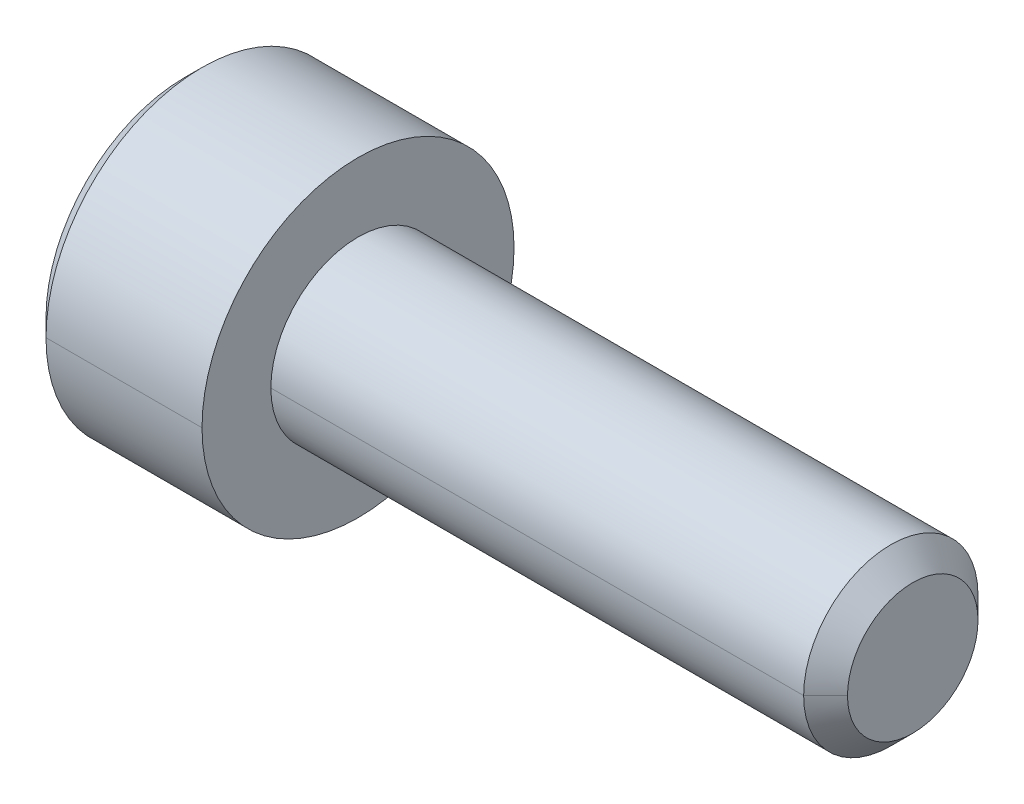
ISO-10303-21;
HEADER;
FILE_DESCRIPTION(('STEP AP214'),'2;1');
FILE_NAME('part.step','',(''),(''),'','','');
FILE_SCHEMA(('AUTOMOTIVE_DESIGN { 1 0 10303 214 1 1 1 1 }'));
ENDSEC;
DATA;
#1=APPLICATION_CONTEXT('core data for automotive mechanical design processes');
#2=APPLICATION_PROTOCOL_DEFINITION('international standard','automotive_design',2000,#1);
#3=PRODUCT_CONTEXT('',#1,'mechanical');
#4=PRODUCT('Part','Part','',(#3));
#5=PRODUCT_RELATED_PRODUCT_CATEGORY('part','',(#4));
#6=PRODUCT_DEFINITION_FORMATION('','',#4);
#7=PRODUCT_DEFINITION_CONTEXT('part definition',#1,'design');
#8=PRODUCT_DEFINITION('design','',#6,#7);
#9=PRODUCT_DEFINITION_SHAPE('','',#8);
#10=(LENGTH_UNIT() NAMED_UNIT(*) SI_UNIT(.MILLI.,.METRE.));
#11=(NAMED_UNIT(*) PLANE_ANGLE_UNIT() SI_UNIT($,.RADIAN.));
#12=(NAMED_UNIT(*) SI_UNIT($,.STERADIAN.) SOLID_ANGLE_UNIT());
#13=UNCERTAINTY_MEASURE_WITH_UNIT(LENGTH_MEASURE(1.E-05),#10,'distance_accuracy_value','');
#14=(GEOMETRIC_REPRESENTATION_CONTEXT(3) GLOBAL_UNCERTAINTY_ASSIGNED_CONTEXT((#13)) GLOBAL_UNIT_ASSIGNED_CONTEXT((#10,
#11,#12)) REPRESENTATION_CONTEXT('',''));
#15=CARTESIAN_POINT('',(0.,0.,0.));
#16=DIRECTION('',(0.,0.,1.));
#17=DIRECTION('',(1.,0.,0.));
#18=AXIS2_PLACEMENT_3D('',#15,#16,#17);
#19=CARTESIAN_POINT('',(-2.50000008,1.016,0.));
#20=DIRECTION('',(1.,0.,0.));
#21=DIRECTION('',(0.,0.,-1.));
#22=AXIS2_PLACEMENT_3D('',#19,#20,#21);
#23=PLANE('',#22);
#24=CARTESIAN_POINT('',(-2.50000008,0.,0.));
#25=DIRECTION('',(1.,0.,0.));
#26=DIRECTION('',(0.,0.,-1.));
#27=AXIS2_PLACEMENT_3D('',#24,#25,#26);
#28=CIRCLE('',#27,2.00006407);
#29=CARTESIAN_POINT('',(-2.50000008,0.,2.00006407));
#30=VERTEX_POINT('',#29);
#31=CARTESIAN_POINT('',(-2.50000008,0.,-2.00006407));
#32=VERTEX_POINT('',#31);
#33=EDGE_CURVE('E11',#30,#32,#28,.T.);
#34=ORIENTED_EDGE('',*,*,#33,.F.);
#35=CARTESIAN_POINT('',(-2.50000008,0.,0.));
#36=DIRECTION('',(1.,0.,0.));
#37=DIRECTION('',(0.,0.,-1.));
#38=AXIS2_PLACEMENT_3D('',#35,#36,#37);
#39=CIRCLE('',#38,2.00006407);
#40=EDGE_CURVE('E25',#32,#30,#39,.T.);
#41=ORIENTED_EDGE('',*,*,#40,.F.);
#42=EDGE_LOOP('',(#34,#41));
#43=FACE_BOUND('',#42,.T.);
#44=DIRECTION('',(0.,0.866025403784439,-0.5));
#45=VECTOR('',#44,1.);
#46=CARTESIAN_POINT('',(-2.50000008,0.,1.1806547423804));
#47=LINE('',#46,#45);
#48=CARTESIAN_POINT('',(-2.50000008,0.,1.1806547423804));
#49=VERTEX_POINT('',#48);
#50=CARTESIAN_POINT('',(-2.50000008,1.022477,0.5903273711902));
#51=VERTEX_POINT('',#50);
#52=EDGE_CURVE('E300',#49,#51,#47,.T.);
#53=ORIENTED_EDGE('',*,*,#52,.F.);
#54=DIRECTION('',(0.,0.866025403784439,0.5));
#55=VECTOR('',#54,1.);
#56=CARTESIAN_POINT('',(-2.50000008,-1.022477,0.5903273711902));
#57=LINE('',#56,#55);
#58=CARTESIAN_POINT('',(-2.50000008,-1.022477,0.5903273711902));
#59=VERTEX_POINT('',#58);
#60=EDGE_CURVE('E295',#59,#49,#57,.T.);
#61=ORIENTED_EDGE('',*,*,#60,.F.);
#62=DIRECTION('',(0.,0.,1.));
#63=VECTOR('',#62,1.);
#64=CARTESIAN_POINT('',(-2.50000008,-1.022477,-0.5903273711902));
#65=LINE('',#64,#63);
#66=CARTESIAN_POINT('',(-2.50000008,-1.022477,-0.5903273711902));
#67=VERTEX_POINT('',#66);
#68=EDGE_CURVE('E290',#67,#59,#65,.T.);
#69=ORIENTED_EDGE('',*,*,#68,.F.);
#70=DIRECTION('',(0.,-0.866025403784439,0.5));
#71=VECTOR('',#70,1.);
#72=CARTESIAN_POINT('',(-2.50000008,0.,-1.1806547423804));
#73=LINE('',#72,#71);
#74=CARTESIAN_POINT('',(-2.50000008,0.,-1.1806547423804));
#75=VERTEX_POINT('',#74);
#76=EDGE_CURVE('E285',#75,#67,#73,.T.);
#77=ORIENTED_EDGE('',*,*,#76,.F.);
#78=DIRECTION('',(0.,-0.866025403784439,-0.5));
#79=VECTOR('',#78,1.);
#80=CARTESIAN_POINT('',(-2.50000008,1.022477,-0.5903273711902));
#81=LINE('',#80,#79);
#82=CARTESIAN_POINT('',(-2.50000008,1.022477,-0.5903273711902));
#83=VERTEX_POINT('',#82);
#84=EDGE_CURVE('E280',#83,#75,#81,.T.);
#85=ORIENTED_EDGE('',*,*,#84,.F.);
#86=DIRECTION('',(0.,0.,1.));
#87=VECTOR('',#86,1.);
#88=CARTESIAN_POINT('',(-2.50000008,1.022477,0.));
#89=LINE('',#88,#87);
#90=EDGE_CURVE('E276',#83,#51,#89,.T.);
#91=ORIENTED_EDGE('',*,*,#90,.T.);
#92=EDGE_LOOP('',(#53,#61,#69,#77,#85,#91));
#93=FACE_BOUND('',#92,.T.);
#94=ADVANCED_FACE('F17',(#43,#93),#23,.F.);
#95=CARTESIAN_POINT('',(-1.40780008,1.022477,0.5903273711902));
#96=DIRECTION('',(0.,1.,0.));
#97=DIRECTION('',(0.,0.,1.));
#98=AXIS2_PLACEMENT_3D('',#95,#96,#97);
#99=PLANE('',#98);
#100=DIRECTION('',(-1.,0.,0.));
#101=VECTOR('',#100,1.);
#102=CARTESIAN_POINT('',(-1.40780008,1.022477,0.5903273711902));
#103=LINE('',#102,#101);
#104=CARTESIAN_POINT('',(-1.40780008,1.022477,0.5903273711902));
#105=VERTEX_POINT('',#104);
#106=EDGE_CURVE('E271',#105,#51,#103,.T.);
#107=ORIENTED_EDGE('',*,*,#106,.T.);
#108=ORIENTED_EDGE('',*,*,#90,.F.);
#109=DIRECTION('',(-1.,0.,0.));
#110=VECTOR('',#109,1.);
#111=CARTESIAN_POINT('',(-1.40780008,1.022477,-0.5903273711902));
#112=LINE('',#111,#110);
#113=CARTESIAN_POINT('',(-1.40780008,1.022477,-0.5903273711902));
#114=VERTEX_POINT('',#113);
#115=EDGE_CURVE('E266',#114,#83,#112,.T.);
#116=ORIENTED_EDGE('',*,*,#115,.F.);
#117=DIRECTION('',(0.,0.,-1.));
#118=VECTOR('',#117,1.);
#119=CARTESIAN_POINT('',(-1.40780008,1.022477,0.5903273711902));
#120=LINE('',#119,#118);
#121=EDGE_CURVE('E261',#105,#114,#120,.T.);
#122=ORIENTED_EDGE('',*,*,#121,.F.);
#123=EDGE_LOOP('',(#107,#108,#116,#122));
#124=FACE_BOUND('',#123,.T.);
#125=ADVANCED_FACE('F335',(#124),#99,.F.);
#126=CARTESIAN_POINT('',(-1.40780008,0.,0.));
#127=DIRECTION('',(-1.,0.,0.));
#128=DIRECTION('',(0.,0.,1.));
#129=AXIS2_PLACEMENT_3D('',#126,#127,#128);
#130=PLANE('',#129);
#131=DIRECTION('',(0.,0.,1.));
#132=VECTOR('',#131,1.);
#133=CARTESIAN_POINT('',(-1.40780008,-1.022477,-0.5903273711902));
#134=LINE('',#133,#132);
#135=CARTESIAN_POINT('',(-1.40780008,-1.022477,-0.5903273711902));
#136=VERTEX_POINT('',#135);
#137=CARTESIAN_POINT('',(-1.40780008,-1.022477,0.5903273711902));
#138=VERTEX_POINT('',#137);
#139=EDGE_CURVE('E257',#136,#138,#134,.T.);
#140=ORIENTED_EDGE('',*,*,#139,.T.);
#141=DIRECTION('',(0.,0.866025403784439,0.5));
#142=VECTOR('',#141,1.);
#143=CARTESIAN_POINT('',(-1.40780008,-1.022477,0.5903273711902));
#144=LINE('',#143,#142);
#145=CARTESIAN_POINT('',(-1.40780008,0.,1.1806547423804));
#146=VERTEX_POINT('',#145);
#147=EDGE_CURVE('E253',#138,#146,#144,.T.);
#148=ORIENTED_EDGE('',*,*,#147,.T.);
#149=DIRECTION('',(0.,0.866025403784439,-0.5));
#150=VECTOR('',#149,1.);
#151=CARTESIAN_POINT('',(-1.40780008,0.,1.1806547423804));
#152=LINE('',#151,#150);
#153=EDGE_CURVE('E248',#146,#105,#152,.T.);
#154=ORIENTED_EDGE('',*,*,#153,.T.);
#155=ORIENTED_EDGE('',*,*,#121,.T.);
#156=DIRECTION('',(0.,-0.866025403784439,-0.5));
#157=VECTOR('',#156,1.);
#158=CARTESIAN_POINT('',(-1.40780008,1.022477,-0.5903273711902));
#159=LINE('',#158,#157);
#160=CARTESIAN_POINT('',(-1.40780008,0.,-1.1806547423804));
#161=VERTEX_POINT('',#160);
#162=EDGE_CURVE('E244',#114,#161,#159,.T.);
#163=ORIENTED_EDGE('',*,*,#162,.T.);
#164=DIRECTION('',(0.,-0.866025403784439,0.5));
#165=VECTOR('',#164,1.);
#166=CARTESIAN_POINT('',(-1.40780008,0.,-1.1806547423804));
#167=LINE('',#166,#165);
#168=EDGE_CURVE('E240',#161,#136,#167,.T.);
#169=ORIENTED_EDGE('',*,*,#168,.T.);
#170=EDGE_LOOP('',(#140,#148,#154,#155,#163,#169));
#171=FACE_BOUND('',#170,.T.);
#172=CARTESIAN_POINT('',(-1.40780008,0.,0.));
#173=DIRECTION('',(1.,0.,0.));
#174=DIRECTION('',(0.,0.,1.));
#175=AXIS2_PLACEMENT_3D('',#172,#173,#174);
#176=CIRCLE('',#175,1.00003203499993);
#177=CARTESIAN_POINT('',(-1.40780008,0.,1.00003203499993));
#178=VERTEX_POINT('',#177);
#179=CARTESIAN_POINT('',(-1.40780008,0.,-1.00003203499993));
#180=VERTEX_POINT('',#179);
#181=EDGE_CURVE('E236',#178,#180,#176,.T.);
#182=ORIENTED_EDGE('',*,*,#181,.T.);
#183=CARTESIAN_POINT('',(-1.40780008,0.,0.));
#184=DIRECTION('',(1.,0.,0.));
#185=DIRECTION('',(0.,0.,1.));
#186=AXIS2_PLACEMENT_3D('',#183,#184,#185);
#187=CIRCLE('',#186,1.00003203499993);
#188=EDGE_CURVE('E232',#180,#178,#187,.T.);
#189=ORIENTED_EDGE('',*,*,#188,.T.);
#190=EDGE_LOOP('',(#182,#189));
#191=FACE_BOUND('',#190,.T.);
#192=ADVANCED_FACE('F339',(#171,#191),#130,.T.);
#193=CARTESIAN_POINT('',(-0.8304313153945,0.,0.));
#194=DIRECTION('',(-1.,0.,0.));
#195=DIRECTION('',(0.,-1.,0.));
#196=AXIS2_PLACEMENT_3D('',#193,#194,#195);
#197=CONICAL_SURFACE('',#196,0.,1.04719755119657);
#198=DIRECTION('',(-0.500000000000026,0.,0.866025403784424));
#199=VECTOR('',#198,1.);
#200=CARTESIAN_POINT('',(-0.8304313153945,0.,0.));
#201=LINE('',#200,#199);
#202=CARTESIAN_POINT('',(-0.8304313153945,0.,0.));
#203=VERTEX_POINT('',#202);
#204=EDGE_CURVE('E227',#203,#178,#201,.T.);
#205=ORIENTED_EDGE('',*,*,#204,.T.);
#206=ORIENTED_EDGE('',*,*,#188,.F.);
#207=DIRECTION('',(-0.500000000000026,0.,-0.866025403784424));
#208=VECTOR('',#207,1.);
#209=CARTESIAN_POINT('',(-0.8304313153945,0.,0.));
#210=LINE('',#209,#208);
#211=EDGE_CURVE('E222',#203,#180,#210,.T.);
#212=ORIENTED_EDGE('',*,*,#211,.F.);
#213=EDGE_LOOP('',(#205,#206,#212));
#214=FACE_BOUND('',#213,.T.);
#215=ADVANCED_FACE('F366',(#214),#197,.F.);
#216=CARTESIAN_POINT('',(-0.8304313153945,0.,0.));
#217=DIRECTION('',(-1.,0.,0.));
#218=DIRECTION('',(0.,1.,0.));
#219=AXIS2_PLACEMENT_3D('',#216,#217,#218);
#220=CONICAL_SURFACE('',#219,0.,1.04719755119657);
#221=ORIENTED_EDGE('',*,*,#211,.T.);
#222=ORIENTED_EDGE('',*,*,#181,.F.);
#223=ORIENTED_EDGE('',*,*,#204,.F.);
#224=EDGE_LOOP('',(#221,#222,#223));
#225=FACE_BOUND('',#224,.T.);
#226=ADVANCED_FACE('F372',(#225),#220,.F.);
#227=CARTESIAN_POINT('',(-1.40780008,0.,-1.1806547423804));
#228=DIRECTION('',(0.,-0.5,-0.866025403784439));
#229=DIRECTION('',(0.,0.866025403784439,-0.5));
#230=AXIS2_PLACEMENT_3D('',#227,#228,#229);
#231=PLANE('',#230);
#232=ORIENTED_EDGE('',*,*,#76,.T.);
#233=DIRECTION('',(-1.,0.,0.));
#234=VECTOR('',#233,1.);
#235=CARTESIAN_POINT('',(-1.40780008,-1.022477,-0.5903273711902));
#236=LINE('',#235,#234);
#237=EDGE_CURVE('E217',#136,#67,#236,.T.);
#238=ORIENTED_EDGE('',*,*,#237,.F.);
#239=ORIENTED_EDGE('',*,*,#168,.F.);
#240=DIRECTION('',(-1.,0.,0.));
#241=VECTOR('',#240,1.);
#242=CARTESIAN_POINT('',(-1.40780008,0.,-1.1806547423804));
#243=LINE('',#242,#241);
#244=EDGE_CURVE('E212',#161,#75,#243,.T.);
#245=ORIENTED_EDGE('',*,*,#244,.T.);
#246=EDGE_LOOP('',(#232,#238,#239,#245));
#247=FACE_BOUND('',#246,.T.);
#248=ADVANCED_FACE('F359',(#247),#231,.F.);
#249=CARTESIAN_POINT('',(-1.40780008,1.022477,-0.5903273711902));
#250=DIRECTION('',(0.,0.5,-0.866025403784439));
#251=DIRECTION('',(0.,0.866025403784439,0.5));
#252=AXIS2_PLACEMENT_3D('',#249,#250,#251);
#253=PLANE('',#252);
#254=ORIENTED_EDGE('',*,*,#84,.T.);
#255=ORIENTED_EDGE('',*,*,#244,.F.);
#256=ORIENTED_EDGE('',*,*,#162,.F.);
#257=ORIENTED_EDGE('',*,*,#115,.T.);
#258=EDGE_LOOP('',(#254,#255,#256,#257));
#259=FACE_BOUND('',#258,.T.);
#260=ADVANCED_FACE('F362',(#259),#253,.F.);
#261=CARTESIAN_POINT('',(-1.40780008,-1.022477,-0.5903273711902));
#262=DIRECTION('',(0.,-1.,0.));
#263=DIRECTION('',(0.,0.,-1.));
#264=AXIS2_PLACEMENT_3D('',#261,#262,#263);
#265=PLANE('',#264);
#266=ORIENTED_EDGE('',*,*,#68,.T.);
#267=DIRECTION('',(-1.,0.,0.));
#268=VECTOR('',#267,1.);
#269=CARTESIAN_POINT('',(-1.40780008,-1.022477,0.5903273711902));
#270=LINE('',#269,#268);
#271=EDGE_CURVE('E207',#138,#59,#270,.T.);
#272=ORIENTED_EDGE('',*,*,#271,.F.);
#273=ORIENTED_EDGE('',*,*,#139,.F.);
#274=ORIENTED_EDGE('',*,*,#237,.T.);
#275=EDGE_LOOP('',(#266,#272,#273,#274));
#276=FACE_BOUND('',#275,.T.);
#277=ADVANCED_FACE('F354',(#276),#265,.F.);
#278=CARTESIAN_POINT('',(-1.40780008,-1.022477,0.5903273711902));
#279=DIRECTION('',(0.,-0.5,0.866025403784439));
#280=DIRECTION('',(0.,-0.866025403784439,-0.5));
#281=AXIS2_PLACEMENT_3D('',#278,#279,#280);
#282=PLANE('',#281);
#283=ORIENTED_EDGE('',*,*,#60,.T.);
#284=DIRECTION('',(-1.,0.,0.));
#285=VECTOR('',#284,1.);
#286=CARTESIAN_POINT('',(-1.40780008,0.,1.1806547423804));
#287=LINE('',#286,#285);
#288=EDGE_CURVE('E202',#146,#49,#287,.T.);
#289=ORIENTED_EDGE('',*,*,#288,.F.);
#290=ORIENTED_EDGE('',*,*,#147,.F.);
#291=ORIENTED_EDGE('',*,*,#271,.T.);
#292=EDGE_LOOP('',(#283,#289,#290,#291));
#293=FACE_BOUND('',#292,.T.);
#294=ADVANCED_FACE('F350',(#293),#282,.F.);
#295=CARTESIAN_POINT('',(-1.40780008,0.,1.1806547423804));
#296=DIRECTION('',(0.,0.5,0.866025403784439));
#297=DIRECTION('',(0.,-0.866025403784439,0.5));
#298=AXIS2_PLACEMENT_3D('',#295,#296,#297);
#299=PLANE('',#298);
#300=ORIENTED_EDGE('',*,*,#52,.T.);
#301=ORIENTED_EDGE('',*,*,#106,.F.);
#302=ORIENTED_EDGE('',*,*,#153,.F.);
#303=ORIENTED_EDGE('',*,*,#288,.T.);
#304=EDGE_LOOP('',(#300,#301,#302,#303));
#305=FACE_BOUND('',#304,.T.);
#306=ADVANCED_FACE('F347',(#305),#299,.F.);
#307=CARTESIAN_POINT('',(-2.50000008,0.,0.));
#308=DIRECTION('',(1.,0.,0.));
#309=DIRECTION('',(0.,-1.,0.));
#310=AXIS2_PLACEMENT_3D('',#307,#308,#309);
#311=CONICAL_SURFACE('',#310,2.00006407,0.785398163397446);
#312=DIRECTION('',(0.707106781186549,0.,0.707106781186546));
#313=VECTOR('',#312,1.);
#314=CARTESIAN_POINT('',(-2.50000008,0.,2.00006407));
#315=LINE('',#314,#313);
#316=CARTESIAN_POINT('',(-2.25006408,0.,2.25000007));
#317=VERTEX_POINT('',#316);
#318=EDGE_CURVE('E198',#30,#317,#315,.T.);
#319=ORIENTED_EDGE('',*,*,#318,.T.);
#320=CARTESIAN_POINT('',(-2.25006408,0.,0.));
#321=DIRECTION('',(1.,0.,0.));
#322=DIRECTION('',(0.,0.,-1.));
#323=AXIS2_PLACEMENT_3D('',#320,#321,#322);
#324=CIRCLE('',#323,2.25000007);
#325=CARTESIAN_POINT('',(-2.25006408,0.,-2.25000007));
#326=VERTEX_POINT('',#325);
#327=EDGE_CURVE('E193',#326,#317,#324,.T.);
#328=ORIENTED_EDGE('',*,*,#327,.F.);
#329=DIRECTION('',(0.707106781186549,0.,-0.707106781186546));
#330=VECTOR('',#329,1.);
#331=CARTESIAN_POINT('',(-2.50000008,0.,-2.00006407));
#332=LINE('',#331,#330);
#333=EDGE_CURVE('E188',#32,#326,#332,.T.);
#334=ORIENTED_EDGE('',*,*,#333,.F.);
#335=ORIENTED_EDGE('',*,*,#40,.T.);
#336=EDGE_LOOP('',(#319,#328,#334,#335));
#337=FACE_BOUND('',#336,.T.);
#338=ADVANCED_FACE('F310',(#337),#311,.T.);
#339=CARTESIAN_POINT('',(-2.50000008,0.,0.));
#340=DIRECTION('',(1.,0.,0.));
#341=DIRECTION('',(0.,1.,0.));
#342=AXIS2_PLACEMENT_3D('',#339,#340,#341);
#343=CONICAL_SURFACE('',#342,2.00006407,0.785398163397446);
#344=ORIENTED_EDGE('',*,*,#318,.F.);
#345=ORIENTED_EDGE('',*,*,#33,.T.);
#346=ORIENTED_EDGE('',*,*,#333,.T.);
#347=CARTESIAN_POINT('',(-2.25006408,0.,0.));
#348=DIRECTION('',(1.,0.,0.));
#349=DIRECTION('',(0.,0.,-1.));
#350=AXIS2_PLACEMENT_3D('',#347,#348,#349);
#351=CIRCLE('',#350,2.25000007);
#352=EDGE_CURVE('E183',#317,#326,#351,.T.);
#353=ORIENTED_EDGE('',*,*,#352,.F.);
#354=EDGE_LOOP('',(#344,#345,#346,#353));
#355=FACE_BOUND('',#354,.T.);
#356=ADVANCED_FACE('F313',(#355),#343,.T.);
#357=CARTESIAN_POINT('',(8.,0.,0.));
#358=DIRECTION('',(1.,0.,0.));
#359=DIRECTION('',(0.,1.,0.));
#360=AXIS2_PLACEMENT_3D('',#357,#358,#359);
#361=CYLINDRICAL_SURFACE('',#360,2.25000007);
#362=DIRECTION('',(1.,0.,0.));
#363=VECTOR('',#362,1.);
#364=CARTESIAN_POINT('',(-2.25006408,0.,2.25000007));
#365=LINE('',#364,#363);
#366=CARTESIAN_POINT('',(0.,0.,2.25000007));
#367=VERTEX_POINT('',#366);
#368=EDGE_CURVE('E178',#317,#367,#365,.T.);
#369=ORIENTED_EDGE('',*,*,#368,.F.);
#370=ORIENTED_EDGE('',*,*,#352,.T.);
#371=DIRECTION('',(1.,0.,0.));
#372=VECTOR('',#371,1.);
#373=CARTESIAN_POINT('',(-2.25006408,0.,-2.25000007));
#374=LINE('',#373,#372);
#375=CARTESIAN_POINT('',(0.,0.,-2.25000007));
#376=VERTEX_POINT('',#375);
#377=EDGE_CURVE('E174',#326,#376,#374,.T.);
#378=ORIENTED_EDGE('',*,*,#377,.T.);
#379=CARTESIAN_POINT('',(0.,0.,0.));
#380=DIRECTION('',(1.,0.,0.));
#381=DIRECTION('',(0.,0.,-1.));
#382=AXIS2_PLACEMENT_3D('',#379,#380,#381);
#383=CIRCLE('',#382,2.25000007);
#384=EDGE_CURVE('E169',#367,#376,#383,.T.);
#385=ORIENTED_EDGE('',*,*,#384,.F.);
#386=EDGE_LOOP('',(#369,#370,#378,#385));
#387=FACE_BOUND('',#386,.T.);
#388=ADVANCED_FACE('F317',(#387),#361,.T.);
#389=CARTESIAN_POINT('',(0.,2.25000007,0.));
#390=DIRECTION('',(-1.,0.,0.));
#391=DIRECTION('',(0.,0.,1.));
#392=AXIS2_PLACEMENT_3D('',#389,#390,#391);
#393=PLANE('',#392);
#394=CARTESIAN_POINT('',(0.,0.,0.));
#395=DIRECTION('',(1.,0.,0.));
#396=DIRECTION('',(0.,0.,-1.));
#397=AXIS2_PLACEMENT_3D('',#394,#395,#396);
#398=CIRCLE('',#397,1.2573);
#399=CARTESIAN_POINT('',(0.,0.,1.2573));
#400=VERTEX_POINT('',#399);
#401=CARTESIAN_POINT('',(0.,0.,-1.2573));
#402=VERTEX_POINT('',#401);
#403=EDGE_CURVE('E164',#400,#402,#398,.T.);
#404=ORIENTED_EDGE('',*,*,#403,.F.);
#405=CARTESIAN_POINT('',(0.,0.,0.));
#406=DIRECTION('',(1.,0.,0.));
#407=DIRECTION('',(0.,0.,-1.));
#408=AXIS2_PLACEMENT_3D('',#405,#406,#407);
#409=CIRCLE('',#408,1.2573);
#410=EDGE_CURVE('E159',#402,#400,#409,.T.);
#411=ORIENTED_EDGE('',*,*,#410,.F.);
#412=EDGE_LOOP('',(#404,#411));
#413=FACE_BOUND('',#412,.T.);
#414=CARTESIAN_POINT('',(0.,0.,0.));
#415=DIRECTION('',(1.,0.,0.));
#416=DIRECTION('',(0.,0.,-1.));
#417=AXIS2_PLACEMENT_3D('',#414,#415,#416);
#418=CIRCLE('',#417,2.25000007);
#419=EDGE_CURVE('E154',#376,#367,#418,.T.);
#420=ORIENTED_EDGE('',*,*,#419,.T.);
#421=ORIENTED_EDGE('',*,*,#384,.T.);
#422=EDGE_LOOP('',(#420,#421));
#423=FACE_BOUND('',#422,.T.);
#424=ADVANCED_FACE('F322',(#413,#423),#393,.F.);
#425=CARTESIAN_POINT('',(8.,0.,0.));
#426=DIRECTION('',(1.,0.,0.));
#427=DIRECTION('',(0.,-1.,0.));
#428=AXIS2_PLACEMENT_3D('',#425,#426,#427);
#429=CYLINDRICAL_SURFACE('',#428,2.25000007);
#430=ORIENTED_EDGE('',*,*,#368,.T.);
#431=ORIENTED_EDGE('',*,*,#419,.F.);
#432=ORIENTED_EDGE('',*,*,#377,.F.);
#433=ORIENTED_EDGE('',*,*,#327,.T.);
#434=EDGE_LOOP('',(#430,#431,#432,#433));
#435=FACE_BOUND('',#434,.T.);
#436=ADVANCED_FACE('F320',(#435),#429,.T.);
#437=CARTESIAN_POINT('',(8.,0.,0.));
#438=DIRECTION('',(1.,0.,0.));
#439=DIRECTION('',(0.,-1.,0.));
#440=AXIS2_PLACEMENT_3D('',#437,#438,#439);
#441=CYLINDRICAL_SURFACE('',#440,1.2573);
#442=DIRECTION('',(1.,0.,0.));
#443=VECTOR('',#442,1.);
#444=CARTESIAN_POINT('',(0.,0.,1.2573));
#445=LINE('',#444,#443);
#446=CARTESIAN_POINT('',(7.68377,0.,1.2573));
#447=VERTEX_POINT('',#446);
#448=EDGE_CURVE('E150',#400,#447,#445,.T.);
#449=ORIENTED_EDGE('',*,*,#448,.T.);
#450=CARTESIAN_POINT('',(7.68377,0.,0.));
#451=DIRECTION('',(1.,0.,0.));
#452=DIRECTION('',(0.,0.,-1.));
#453=AXIS2_PLACEMENT_3D('',#450,#451,#452);
#454=CIRCLE('',#453,1.2573);
#455=CARTESIAN_POINT('',(7.68377,0.,-1.2573));
#456=VERTEX_POINT('',#455);
#457=EDGE_CURVE('E128',#456,#447,#454,.T.);
#458=ORIENTED_EDGE('',*,*,#457,.F.);
#459=DIRECTION('',(1.,0.,0.));
#460=VECTOR('',#459,1.);
#461=CARTESIAN_POINT('',(0.,0.,-1.2573));
#462=LINE('',#461,#460);
#463=EDGE_CURVE('E142',#402,#456,#462,.T.);
#464=ORIENTED_EDGE('',*,*,#463,.F.);
#465=ORIENTED_EDGE('',*,*,#410,.T.);
#466=EDGE_LOOP('',(#449,#458,#464,#465));
#467=FACE_BOUND('',#466,.T.);
#468=ADVANCED_FACE('F331',(#467),#441,.T.);
#469=CARTESIAN_POINT('',(8.,0.,0.));
#470=DIRECTION('',(1.,0.,0.));
#471=DIRECTION('',(0.,1.,0.));
#472=AXIS2_PLACEMENT_3D('',#469,#470,#471);
#473=CYLINDRICAL_SURFACE('',#472,1.2573);
#474=ORIENTED_EDGE('',*,*,#448,.F.);
#475=ORIENTED_EDGE('',*,*,#403,.T.);
#476=ORIENTED_EDGE('',*,*,#463,.T.);
#477=CARTESIAN_POINT('',(7.68377,0.,0.));
#478=DIRECTION('',(1.,0.,0.));
#479=DIRECTION('',(0.,0.,-1.));
#480=AXIS2_PLACEMENT_3D('',#477,#478,#479);
#481=CIRCLE('',#480,1.2573);
#482=EDGE_CURVE('E138',#447,#456,#481,.T.);
#483=ORIENTED_EDGE('',*,*,#482,.F.);
#484=EDGE_LOOP('',(#474,#475,#476,#483));
#485=FACE_BOUND('',#484,.T.);
#486=ADVANCED_FACE('F429',(#485),#473,.T.);
#487=CARTESIAN_POINT('',(7.68377,0.,0.));
#488=DIRECTION('',(-1.,0.,0.));
#489=DIRECTION('',(0.,1.,0.));
#490=AXIS2_PLACEMENT_3D('',#487,#488,#489);
#491=CONICAL_SURFACE('',#490,1.2573,0.785398163397449);
#492=DIRECTION('',(-0.707106781186548,0.,-0.707106781186548));
#493=VECTOR('',#492,1.);
#494=CARTESIAN_POINT('',(8.,0.,-0.94107));
#495=LINE('',#494,#493);
#496=CARTESIAN_POINT('',(8.,0.,-0.94107));
#497=VERTEX_POINT('',#496);
#498=EDGE_CURVE('E119',#497,#456,#495,.T.);
#499=ORIENTED_EDGE('',*,*,#498,.F.);
#500=CARTESIAN_POINT('',(8.,0.,0.));
#501=DIRECTION('',(1.,0.,0.));
#502=DIRECTION('',(0.,0.,-1.));
#503=AXIS2_PLACEMENT_3D('',#500,#501,#502);
#504=CIRCLE('',#503,0.94107);
#505=CARTESIAN_POINT('',(8.,0.,0.94107));
#506=VERTEX_POINT('',#505);
#507=EDGE_CURVE('E111',#506,#497,#504,.T.);
#508=ORIENTED_EDGE('',*,*,#507,.F.);
#509=DIRECTION('',(-0.707106781186548,0.,0.707106781186548));
#510=VECTOR('',#509,1.);
#511=CARTESIAN_POINT('',(8.,0.,0.94107));
#512=LINE('',#511,#510);
#513=EDGE_CURVE('E116',#506,#447,#512,.T.);
#514=ORIENTED_EDGE('',*,*,#513,.T.);
#515=ORIENTED_EDGE('',*,*,#482,.T.);
#516=EDGE_LOOP('',(#499,#508,#514,#515));
#517=FACE_BOUND('',#516,.T.);
#518=ADVANCED_FACE('F113',(#517),#491,.T.);
#519=CARTESIAN_POINT('',(7.68377,0.,0.));
#520=DIRECTION('',(-1.,0.,0.));
#521=DIRECTION('',(0.,-1.,0.));
#522=AXIS2_PLACEMENT_3D('',#519,#520,#521);
#523=CONICAL_SURFACE('',#522,1.2573,0.785398163397449);
#524=ORIENTED_EDGE('',*,*,#498,.T.);
#525=ORIENTED_EDGE('',*,*,#457,.T.);
#526=ORIENTED_EDGE('',*,*,#513,.F.);
#527=CARTESIAN_POINT('',(8.,0.,0.));
#528=DIRECTION('',(1.,0.,0.));
#529=DIRECTION('',(0.,0.,-1.));
#530=AXIS2_PLACEMENT_3D('',#527,#528,#529);
#531=CIRCLE('',#530,0.94107);
#532=EDGE_CURVE('E123',#497,#506,#531,.T.);
#533=ORIENTED_EDGE('',*,*,#532,.F.);
#534=EDGE_LOOP('',(#524,#525,#526,#533));
#535=FACE_BOUND('',#534,.T.);
#536=ADVANCED_FACE('F127',(#535),#523,.T.);
#537=CARTESIAN_POINT('',(8.,0.94107,0.));
#538=DIRECTION('',(-1.,0.,0.));
#539=DIRECTION('',(0.,0.,1.));
#540=AXIS2_PLACEMENT_3D('',#537,#538,#539);
#541=PLANE('',#540);
#542=ORIENTED_EDGE('',*,*,#532,.T.);
#543=ORIENTED_EDGE('',*,*,#507,.T.);
#544=EDGE_LOOP('',(#542,#543));
#545=FACE_BOUND('',#544,.T.);
#546=ADVANCED_FACE('F124',(#545),#541,.F.);
#547=CLOSED_SHELL('',(#94,#125,#192,#215,#226,#248,#260,#277,#294,#306,#338,#356,#388,#424,#436,
#468,#486,#518,#536,#546));
#548=MANIFOLD_SOLID_BREP('B1',#547);
#549=ADVANCED_BREP_SHAPE_REPRESENTATION('',(#18,#548),#14);
#550=SHAPE_DEFINITION_REPRESENTATION(#9,#549);
ENDSEC;
END-ISO-10303-21;
